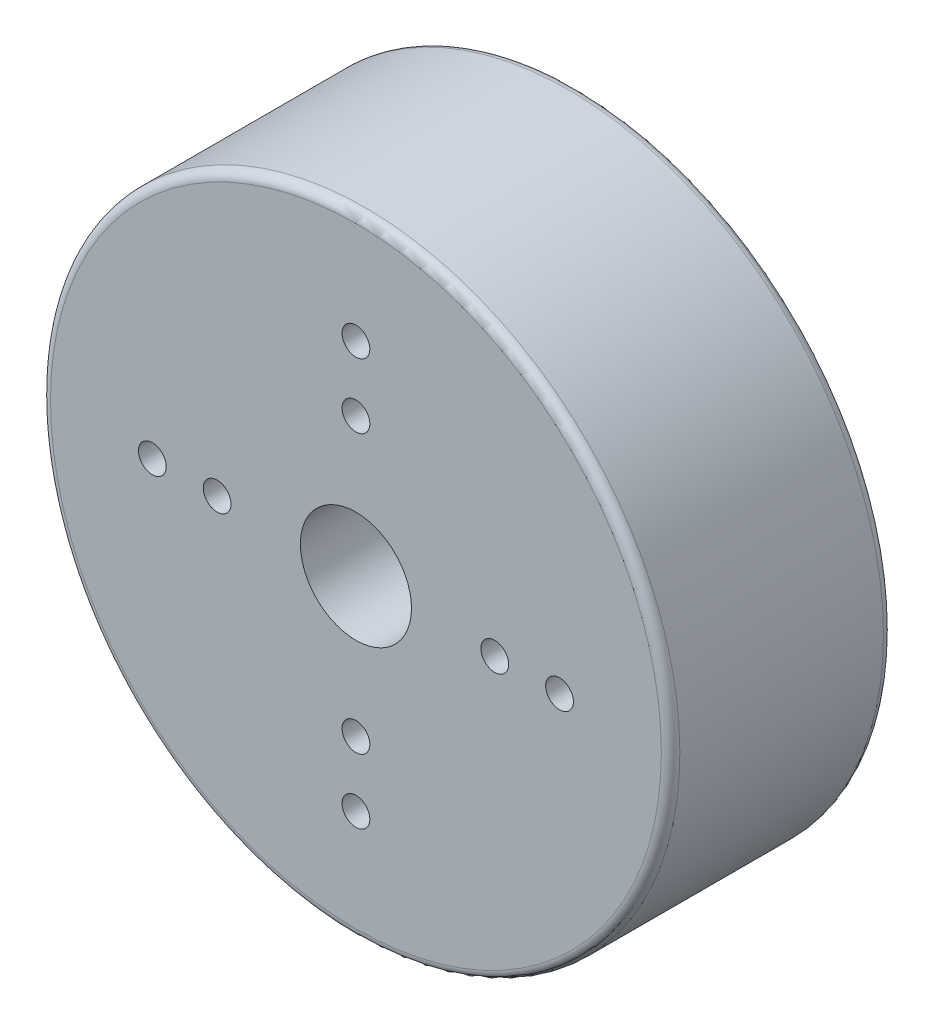
ISO-10303-21;
HEADER;
FILE_DESCRIPTION(('STEP AP214'),'2;1');
FILE_NAME('part.step','',(''),(''),'','','');
FILE_SCHEMA(('AUTOMOTIVE_DESIGN { 1 0 10303 214 1 1 1 1 }'));
ENDSEC;
DATA;
#1=APPLICATION_CONTEXT('core data for automotive mechanical design processes');
#2=APPLICATION_PROTOCOL_DEFINITION('international standard','automotive_design',2000,#1);
#3=PRODUCT_CONTEXT('',#1,'mechanical');
#4=PRODUCT('Part','Part','',(#3));
#5=PRODUCT_RELATED_PRODUCT_CATEGORY('part','',(#4));
#6=PRODUCT_DEFINITION_FORMATION('','',#4);
#7=PRODUCT_DEFINITION_CONTEXT('part definition',#1,'design');
#8=PRODUCT_DEFINITION('design','',#6,#7);
#9=PRODUCT_DEFINITION_SHAPE('','',#8);
#10=(LENGTH_UNIT() NAMED_UNIT(*) SI_UNIT(.MILLI.,.METRE.));
#11=(NAMED_UNIT(*) PLANE_ANGLE_UNIT() SI_UNIT($,.RADIAN.));
#12=(NAMED_UNIT(*) SI_UNIT($,.STERADIAN.) SOLID_ANGLE_UNIT());
#13=UNCERTAINTY_MEASURE_WITH_UNIT(LENGTH_MEASURE(1.E-05),#10,'distance_accuracy_value','');
#14=(GEOMETRIC_REPRESENTATION_CONTEXT(3) GLOBAL_UNCERTAINTY_ASSIGNED_CONTEXT((#13)) GLOBAL_UNIT_ASSIGNED_CONTEXT((#10,
#11,#12)) REPRESENTATION_CONTEXT('',''));
#15=CARTESIAN_POINT('',(0.,0.,0.));
#16=DIRECTION('',(0.,0.,1.));
#17=DIRECTION('',(1.,0.,0.));
#18=AXIS2_PLACEMENT_3D('',#15,#16,#17);
#19=CARTESIAN_POINT('',(0.,0.,24.));
#20=DIRECTION('',(0.,0.,-1.));
#21=DIRECTION('',(-1.,0.,0.));
#22=AXIS2_PLACEMENT_3D('',#19,#20,#21);
#23=CYLINDRICAL_SURFACE('',#22,34.);
#24=CARTESIAN_POINT('',(0.,0.,23.));
#25=DIRECTION('',(0.,0.,1.));
#26=DIRECTION('',(1.,0.,0.));
#27=AXIS2_PLACEMENT_3D('',#24,#25,#26);
#28=CIRCLE('',#27,34.);
#29=CARTESIAN_POINT('',(34.,0.,23.));
#30=VERTEX_POINT('',#29);
#31=EDGE_CURVE('E10',#30,#30,#28,.F.);
#32=ORIENTED_EDGE('',*,*,#31,.T.);
#33=EDGE_LOOP('',(#32));
#34=FACE_BOUND('',#33,.T.);
#35=CARTESIAN_POINT('',(0.,0.,1.));
#36=DIRECTION('',(0.,0.,1.));
#37=DIRECTION('',(1.,0.,0.));
#38=AXIS2_PLACEMENT_3D('',#35,#36,#37);
#39=CIRCLE('',#38,34.);
#40=CARTESIAN_POINT('',(34.,0.,1.));
#41=VERTEX_POINT('',#40);
#42=EDGE_CURVE('E55',#41,#41,#39,.T.);
#43=ORIENTED_EDGE('',*,*,#42,.T.);
#44=EDGE_LOOP('',(#43));
#45=FACE_BOUND('',#44,.T.);
#46=ADVANCED_FACE('F37',(#34,#45),#23,.T.);
#47=CARTESIAN_POINT('',(0.,0.,24.));
#48=DIRECTION('',(0.,0.,1.));
#49=DIRECTION('',(1.,0.,0.));
#50=AXIS2_PLACEMENT_3D('',#47,#48,#49);
#51=PLANE('',#50);
#52=CARTESIAN_POINT('',(0.,0.,24.));
#53=DIRECTION('',(0.,0.,1.));
#54=DIRECTION('',(1.,0.,0.));
#55=AXIS2_PLACEMENT_3D('',#52,#53,#54);
#56=CIRCLE('',#55,33.);
#57=CARTESIAN_POINT('',(33.,0.,24.));
#58=VERTEX_POINT('',#57);
#59=EDGE_CURVE('E45',#58,#58,#56,.T.);
#60=ORIENTED_EDGE('',*,*,#59,.T.);
#61=EDGE_LOOP('',(#60));
#62=FACE_BOUND('',#61,.T.);
#63=CARTESIAN_POINT('',(0.,22.,24.));
#64=DIRECTION('',(0.,0.,1.));
#65=DIRECTION('',(1.,0.,0.));
#66=AXIS2_PLACEMENT_3D('',#63,#64,#65);
#67=CIRCLE('',#66,1.5);
#68=CARTESIAN_POINT('',(1.5,22.,24.));
#69=VERTEX_POINT('',#68);
#70=EDGE_CURVE('E95',#69,#69,#67,.T.);
#71=ORIENTED_EDGE('',*,*,#70,.F.);
#72=EDGE_LOOP('',(#71));
#73=FACE_BOUND('',#72,.T.);
#74=CARTESIAN_POINT('',(0.,-15.,24.));
#75=DIRECTION('',(0.,0.,1.));
#76=DIRECTION('',(1.,0.,0.));
#77=AXIS2_PLACEMENT_3D('',#74,#75,#76);
#78=CIRCLE('',#77,1.5);
#79=CARTESIAN_POINT('',(1.5,-15.,24.));
#80=VERTEX_POINT('',#79);
#81=EDGE_CURVE('E127',#80,#80,#78,.T.);
#82=ORIENTED_EDGE('',*,*,#81,.F.);
#83=EDGE_LOOP('',(#82));
#84=FACE_BOUND('',#83,.T.);
#85=CARTESIAN_POINT('',(15.,0.,24.));
#86=DIRECTION('',(0.,0.,1.));
#87=DIRECTION('',(1.,0.,0.));
#88=AXIS2_PLACEMENT_3D('',#85,#86,#87);
#89=CIRCLE('',#88,1.5);
#90=CARTESIAN_POINT('',(16.5,0.,24.));
#91=VERTEX_POINT('',#90);
#92=EDGE_CURVE('E131',#91,#91,#89,.T.);
#93=ORIENTED_EDGE('',*,*,#92,.F.);
#94=EDGE_LOOP('',(#93));
#95=FACE_BOUND('',#94,.T.);
#96=CARTESIAN_POINT('',(-15.,0.,24.));
#97=DIRECTION('',(0.,0.,1.));
#98=DIRECTION('',(1.,0.,0.));
#99=AXIS2_PLACEMENT_3D('',#96,#97,#98);
#100=CIRCLE('',#99,1.5);
#101=CARTESIAN_POINT('',(-13.5,0.,24.));
#102=VERTEX_POINT('',#101);
#103=EDGE_CURVE('E123',#102,#102,#100,.T.);
#104=ORIENTED_EDGE('',*,*,#103,.F.);
#105=EDGE_LOOP('',(#104));
#106=FACE_BOUND('',#105,.T.);
#107=CARTESIAN_POINT('',(0.,-22.,24.));
#108=DIRECTION('',(0.,0.,1.));
#109=DIRECTION('',(1.,0.,0.));
#110=AXIS2_PLACEMENT_3D('',#107,#108,#109);
#111=CIRCLE('',#110,1.5);
#112=CARTESIAN_POINT('',(1.5,-22.,24.));
#113=VERTEX_POINT('',#112);
#114=EDGE_CURVE('E114',#113,#113,#111,.T.);
#115=ORIENTED_EDGE('',*,*,#114,.F.);
#116=EDGE_LOOP('',(#115));
#117=FACE_BOUND('',#116,.T.);
#118=CARTESIAN_POINT('',(-22.,0.,24.));
#119=DIRECTION('',(0.,0.,1.));
#120=DIRECTION('',(1.,0.,0.));
#121=AXIS2_PLACEMENT_3D('',#118,#119,#120);
#122=CIRCLE('',#121,1.5);
#123=CARTESIAN_POINT('',(-20.5,0.,24.));
#124=VERTEX_POINT('',#123);
#125=EDGE_CURVE('E110',#124,#124,#122,.T.);
#126=ORIENTED_EDGE('',*,*,#125,.F.);
#127=EDGE_LOOP('',(#126));
#128=FACE_BOUND('',#127,.T.);
#129=CARTESIAN_POINT('',(22.,0.,24.));
#130=DIRECTION('',(0.,0.,1.));
#131=DIRECTION('',(1.,0.,0.));
#132=AXIS2_PLACEMENT_3D('',#129,#130,#131);
#133=CIRCLE('',#132,1.5);
#134=CARTESIAN_POINT('',(23.5,0.,24.));
#135=VERTEX_POINT('',#134);
#136=EDGE_CURVE('E115',#135,#135,#133,.T.);
#137=ORIENTED_EDGE('',*,*,#136,.F.);
#138=EDGE_LOOP('',(#137));
#139=FACE_BOUND('',#138,.T.);
#140=CARTESIAN_POINT('',(0.,15.,24.));
#141=DIRECTION('',(0.,0.,1.));
#142=DIRECTION('',(1.,0.,0.));
#143=AXIS2_PLACEMENT_3D('',#140,#141,#142);
#144=CIRCLE('',#143,1.5);
#145=CARTESIAN_POINT('',(1.5,15.,24.));
#146=VERTEX_POINT('',#145);
#147=EDGE_CURVE('E119',#146,#146,#144,.T.);
#148=ORIENTED_EDGE('',*,*,#147,.F.);
#149=EDGE_LOOP('',(#148));
#150=FACE_BOUND('',#149,.T.);
#151=CARTESIAN_POINT('',(0.,0.,24.));
#152=DIRECTION('',(0.,0.,1.));
#153=DIRECTION('',(1.,0.,0.));
#154=AXIS2_PLACEMENT_3D('',#151,#152,#153);
#155=CIRCLE('',#154,6.);
#156=CARTESIAN_POINT('',(6.,0.,24.));
#157=VERTEX_POINT('',#156);
#158=EDGE_CURVE('E103',#157,#157,#155,.T.);
#159=ORIENTED_EDGE('',*,*,#158,.F.);
#160=EDGE_LOOP('',(#159));
#161=FACE_BOUND('',#160,.T.);
#162=ADVANCED_FACE('F145',(#62,#73,#84,#95,#106,#117,#128,#139,#150,#161),#51,.T.);
#163=CARTESIAN_POINT('',(0.,0.,0.));
#164=DIRECTION('',(0.,0.,1.));
#165=DIRECTION('',(1.,0.,0.));
#166=AXIS2_PLACEMENT_3D('',#163,#164,#165);
#167=PLANE('',#166);
#168=CARTESIAN_POINT('',(0.,0.,0.));
#169=DIRECTION('',(0.,0.,1.));
#170=DIRECTION('',(1.,0.,0.));
#171=AXIS2_PLACEMENT_3D('',#168,#169,#170);
#172=CIRCLE('',#171,33.);
#173=CARTESIAN_POINT('',(33.,0.,0.));
#174=VERTEX_POINT('',#173);
#175=EDGE_CURVE('E50',#174,#174,#172,.F.);
#176=ORIENTED_EDGE('',*,*,#175,.T.);
#177=EDGE_LOOP('',(#176));
#178=FACE_BOUND('',#177,.T.);
#179=CARTESIAN_POINT('',(0.,22.,0.));
#180=DIRECTION('',(0.,0.,1.));
#181=DIRECTION('',(1.,0.,0.));
#182=AXIS2_PLACEMENT_3D('',#179,#180,#181);
#183=CIRCLE('',#182,1.5);
#184=CARTESIAN_POINT('',(1.5,22.,0.));
#185=VERTEX_POINT('',#184);
#186=EDGE_CURVE('E62',#185,#185,#183,.T.);
#187=ORIENTED_EDGE('',*,*,#186,.T.);
#188=EDGE_LOOP('',(#187));
#189=FACE_BOUND('',#188,.T.);
#190=CARTESIAN_POINT('',(0.,-15.,0.));
#191=DIRECTION('',(0.,0.,1.));
#192=DIRECTION('',(1.,0.,0.));
#193=AXIS2_PLACEMENT_3D('',#190,#191,#192);
#194=CIRCLE('',#193,1.5);
#195=CARTESIAN_POINT('',(1.5,-15.,0.));
#196=VERTEX_POINT('',#195);
#197=EDGE_CURVE('E67',#196,#196,#194,.T.);
#198=ORIENTED_EDGE('',*,*,#197,.T.);
#199=EDGE_LOOP('',(#198));
#200=FACE_BOUND('',#199,.T.);
#201=CARTESIAN_POINT('',(15.,0.,0.));
#202=DIRECTION('',(0.,0.,1.));
#203=DIRECTION('',(1.,0.,0.));
#204=AXIS2_PLACEMENT_3D('',#201,#202,#203);
#205=CIRCLE('',#204,1.5);
#206=CARTESIAN_POINT('',(16.5,0.,0.));
#207=VERTEX_POINT('',#206);
#208=EDGE_CURVE('E71',#207,#207,#205,.T.);
#209=ORIENTED_EDGE('',*,*,#208,.T.);
#210=EDGE_LOOP('',(#209));
#211=FACE_BOUND('',#210,.T.);
#212=CARTESIAN_POINT('',(-15.,0.,0.));
#213=DIRECTION('',(0.,0.,1.));
#214=DIRECTION('',(1.,0.,0.));
#215=AXIS2_PLACEMENT_3D('',#212,#213,#214);
#216=CIRCLE('',#215,1.5);
#217=CARTESIAN_POINT('',(-13.5,0.,0.));
#218=VERTEX_POINT('',#217);
#219=EDGE_CURVE('E75',#218,#218,#216,.T.);
#220=ORIENTED_EDGE('',*,*,#219,.T.);
#221=EDGE_LOOP('',(#220));
#222=FACE_BOUND('',#221,.T.);
#223=CARTESIAN_POINT('',(0.,-22.,0.));
#224=DIRECTION('',(0.,0.,1.));
#225=DIRECTION('',(1.,0.,0.));
#226=AXIS2_PLACEMENT_3D('',#223,#224,#225);
#227=CIRCLE('',#226,1.5);
#228=CARTESIAN_POINT('',(1.5,-22.,0.));
#229=VERTEX_POINT('',#228);
#230=EDGE_CURVE('E79',#229,#229,#227,.T.);
#231=ORIENTED_EDGE('',*,*,#230,.T.);
#232=EDGE_LOOP('',(#231));
#233=FACE_BOUND('',#232,.T.);
#234=CARTESIAN_POINT('',(-22.,0.,0.));
#235=DIRECTION('',(0.,0.,1.));
#236=DIRECTION('',(1.,0.,0.));
#237=AXIS2_PLACEMENT_3D('',#234,#235,#236);
#238=CIRCLE('',#237,1.5);
#239=CARTESIAN_POINT('',(-20.5,0.,0.));
#240=VERTEX_POINT('',#239);
#241=EDGE_CURVE('E83',#240,#240,#238,.T.);
#242=ORIENTED_EDGE('',*,*,#241,.T.);
#243=EDGE_LOOP('',(#242));
#244=FACE_BOUND('',#243,.T.);
#245=CARTESIAN_POINT('',(22.,0.,0.));
#246=DIRECTION('',(0.,0.,1.));
#247=DIRECTION('',(1.,0.,0.));
#248=AXIS2_PLACEMENT_3D('',#245,#246,#247);
#249=CIRCLE('',#248,1.5);
#250=CARTESIAN_POINT('',(23.5,0.,0.));
#251=VERTEX_POINT('',#250);
#252=EDGE_CURVE('E87',#251,#251,#249,.T.);
#253=ORIENTED_EDGE('',*,*,#252,.T.);
#254=EDGE_LOOP('',(#253));
#255=FACE_BOUND('',#254,.T.);
#256=CARTESIAN_POINT('',(0.,15.,0.));
#257=DIRECTION('',(0.,0.,1.));
#258=DIRECTION('',(1.,0.,0.));
#259=AXIS2_PLACEMENT_3D('',#256,#257,#258);
#260=CIRCLE('',#259,1.5);
#261=CARTESIAN_POINT('',(1.5,15.,0.));
#262=VERTEX_POINT('',#261);
#263=EDGE_CURVE('E91',#262,#262,#260,.T.);
#264=ORIENTED_EDGE('',*,*,#263,.T.);
#265=EDGE_LOOP('',(#264));
#266=FACE_BOUND('',#265,.T.);
#267=CARTESIAN_POINT('',(0.,0.,0.));
#268=DIRECTION('',(0.,0.,-1.));
#269=DIRECTION('',(-1.,0.,0.));
#270=AXIS2_PLACEMENT_3D('',#267,#268,#269);
#271=CIRCLE('',#270,7.);
#272=CARTESIAN_POINT('',(-7.,0.,0.));
#273=VERTEX_POINT('',#272);
#274=EDGE_CURVE('E61',#273,#273,#271,.T.);
#275=ORIENTED_EDGE('',*,*,#274,.F.);
#276=EDGE_LOOP('',(#275));
#277=FACE_BOUND('',#276,.T.);
#278=ADVANCED_FACE('F148',(#178,#189,#200,#211,#222,#233,#244,#255,#266,#277),#167,.F.);
#279=CARTESIAN_POINT('',(0.,0.,-1.1));
#280=DIRECTION('',(0.,0.,1.));
#281=DIRECTION('',(1.,0.,0.));
#282=AXIS2_PLACEMENT_3D('',#279,#280,#281);
#283=CYLINDRICAL_SURFACE('',#282,7.);
#284=CARTESIAN_POINT('',(0.,0.,-1.1));
#285=DIRECTION('',(0.,0.,-1.));
#286=DIRECTION('',(-1.,0.,0.));
#287=AXIS2_PLACEMENT_3D('',#284,#285,#286);
#288=CIRCLE('',#287,7.);
#289=CARTESIAN_POINT('',(-7.,0.,-1.1));
#290=VERTEX_POINT('',#289);
#291=EDGE_CURVE('E99',#290,#290,#288,.T.);
#292=ORIENTED_EDGE('',*,*,#291,.F.);
#293=EDGE_LOOP('',(#292));
#294=FACE_BOUND('',#293,.T.);
#295=ORIENTED_EDGE('',*,*,#274,.T.);
#296=EDGE_LOOP('',(#295));
#297=FACE_BOUND('',#296,.T.);
#298=ADVANCED_FACE('F176',(#294,#297),#283,.T.);
#299=CARTESIAN_POINT('',(0.,0.,-1.1));
#300=DIRECTION('',(0.,0.,-1.));
#301=DIRECTION('',(-1.,0.,0.));
#302=AXIS2_PLACEMENT_3D('',#299,#300,#301);
#303=PLANE('',#302);
#304=CARTESIAN_POINT('',(0.,0.,-1.1));
#305=DIRECTION('',(0.,0.,-1.));
#306=DIRECTION('',(-1.,0.,0.));
#307=AXIS2_PLACEMENT_3D('',#304,#305,#306);
#308=CIRCLE('',#307,6.);
#309=CARTESIAN_POINT('',(-6.,0.,-1.1));
#310=VERTEX_POINT('',#309);
#311=EDGE_CURVE('E66',#310,#310,#308,.T.);
#312=ORIENTED_EDGE('',*,*,#311,.F.);
#313=EDGE_LOOP('',(#312));
#314=FACE_BOUND('',#313,.T.);
#315=ORIENTED_EDGE('',*,*,#291,.T.);
#316=EDGE_LOOP('',(#315));
#317=FACE_BOUND('',#316,.T.);
#318=ADVANCED_FACE('F170',(#314,#317),#303,.T.);
#319=CARTESIAN_POINT('',(0.,0.,27.));
#320=DIRECTION('',(0.,0.,-1.));
#321=DIRECTION('',(-1.,0.,0.));
#322=AXIS2_PLACEMENT_3D('',#319,#320,#321);
#323=CYLINDRICAL_SURFACE('',#322,6.);
#324=ORIENTED_EDGE('',*,*,#158,.T.);
#325=EDGE_LOOP('',(#324));
#326=FACE_BOUND('',#325,.T.);
#327=ORIENTED_EDGE('',*,*,#311,.T.);
#328=EDGE_LOOP('',(#327));
#329=FACE_BOUND('',#328,.T.);
#330=ADVANCED_FACE('F166',(#326,#329),#323,.F.);
#331=CARTESIAN_POINT('',(0.,15.,-4.1));
#332=DIRECTION('',(0.,0.,1.));
#333=DIRECTION('',(1.,0.,0.));
#334=AXIS2_PLACEMENT_3D('',#331,#332,#333);
#335=CYLINDRICAL_SURFACE('',#334,1.5);
#336=ORIENTED_EDGE('',*,*,#147,.T.);
#337=EDGE_LOOP('',(#336));
#338=FACE_BOUND('',#337,.T.);
#339=ORIENTED_EDGE('',*,*,#263,.F.);
#340=EDGE_LOOP('',(#339));
#341=FACE_BOUND('',#340,.T.);
#342=ADVANCED_FACE('F169',(#338,#341),#335,.F.);
#343=CARTESIAN_POINT('',(22.,0.,-4.1));
#344=DIRECTION('',(0.,0.,1.));
#345=DIRECTION('',(1.,0.,0.));
#346=AXIS2_PLACEMENT_3D('',#343,#344,#345);
#347=CYLINDRICAL_SURFACE('',#346,1.5);
#348=ORIENTED_EDGE('',*,*,#136,.T.);
#349=EDGE_LOOP('',(#348));
#350=FACE_BOUND('',#349,.T.);
#351=ORIENTED_EDGE('',*,*,#252,.F.);
#352=EDGE_LOOP('',(#351));
#353=FACE_BOUND('',#352,.T.);
#354=ADVANCED_FACE('F224',(#350,#353),#347,.F.);
#355=CARTESIAN_POINT('',(-22.,0.,-4.1));
#356=DIRECTION('',(0.,0.,1.));
#357=DIRECTION('',(1.,0.,0.));
#358=AXIS2_PLACEMENT_3D('',#355,#356,#357);
#359=CYLINDRICAL_SURFACE('',#358,1.5);
#360=ORIENTED_EDGE('',*,*,#125,.T.);
#361=EDGE_LOOP('',(#360));
#362=FACE_BOUND('',#361,.T.);
#363=ORIENTED_EDGE('',*,*,#241,.F.);
#364=EDGE_LOOP('',(#363));
#365=FACE_BOUND('',#364,.T.);
#366=ADVANCED_FACE('F227',(#362,#365),#359,.F.);
#367=CARTESIAN_POINT('',(0.,-22.,-4.1));
#368=DIRECTION('',(0.,0.,1.));
#369=DIRECTION('',(1.,0.,0.));
#370=AXIS2_PLACEMENT_3D('',#367,#368,#369);
#371=CYLINDRICAL_SURFACE('',#370,1.5);
#372=ORIENTED_EDGE('',*,*,#114,.T.);
#373=EDGE_LOOP('',(#372));
#374=FACE_BOUND('',#373,.T.);
#375=ORIENTED_EDGE('',*,*,#230,.F.);
#376=EDGE_LOOP('',(#375));
#377=FACE_BOUND('',#376,.T.);
#378=ADVANCED_FACE('F219',(#374,#377),#371,.F.);
#379=CARTESIAN_POINT('',(-15.,0.,-4.1));
#380=DIRECTION('',(0.,0.,1.));
#381=DIRECTION('',(1.,0.,0.));
#382=AXIS2_PLACEMENT_3D('',#379,#380,#381);
#383=CYLINDRICAL_SURFACE('',#382,1.5);
#384=ORIENTED_EDGE('',*,*,#103,.T.);
#385=EDGE_LOOP('',(#384));
#386=FACE_BOUND('',#385,.T.);
#387=ORIENTED_EDGE('',*,*,#219,.F.);
#388=EDGE_LOOP('',(#387));
#389=FACE_BOUND('',#388,.T.);
#390=ADVANCED_FACE('F216',(#386,#389),#383,.F.);
#391=CARTESIAN_POINT('',(15.,0.,-4.1));
#392=DIRECTION('',(0.,0.,1.));
#393=DIRECTION('',(1.,0.,0.));
#394=AXIS2_PLACEMENT_3D('',#391,#392,#393);
#395=CYLINDRICAL_SURFACE('',#394,1.5);
#396=ORIENTED_EDGE('',*,*,#92,.T.);
#397=EDGE_LOOP('',(#396));
#398=FACE_BOUND('',#397,.T.);
#399=ORIENTED_EDGE('',*,*,#208,.F.);
#400=EDGE_LOOP('',(#399));
#401=FACE_BOUND('',#400,.T.);
#402=ADVANCED_FACE('F212',(#398,#401),#395,.F.);
#403=CARTESIAN_POINT('',(0.,-15.,-4.1));
#404=DIRECTION('',(0.,0.,1.));
#405=DIRECTION('',(1.,0.,0.));
#406=AXIS2_PLACEMENT_3D('',#403,#404,#405);
#407=CYLINDRICAL_SURFACE('',#406,1.5);
#408=ORIENTED_EDGE('',*,*,#81,.T.);
#409=EDGE_LOOP('',(#408));
#410=FACE_BOUND('',#409,.T.);
#411=ORIENTED_EDGE('',*,*,#197,.F.);
#412=EDGE_LOOP('',(#411));
#413=FACE_BOUND('',#412,.T.);
#414=ADVANCED_FACE('F204',(#410,#413),#407,.F.);
#415=CARTESIAN_POINT('',(0.,22.,-4.1));
#416=DIRECTION('',(0.,0.,1.));
#417=DIRECTION('',(1.,0.,0.));
#418=AXIS2_PLACEMENT_3D('',#415,#416,#417);
#419=CYLINDRICAL_SURFACE('',#418,1.5);
#420=ORIENTED_EDGE('',*,*,#70,.T.);
#421=EDGE_LOOP('',(#420));
#422=FACE_BOUND('',#421,.T.);
#423=ORIENTED_EDGE('',*,*,#186,.F.);
#424=EDGE_LOOP('',(#423));
#425=FACE_BOUND('',#424,.T.);
#426=ADVANCED_FACE('F142',(#422,#425),#419,.F.);
#427=CARTESIAN_POINT('',(0.,0.,1.));
#428=DIRECTION('',(0.,0.,1.));
#429=DIRECTION('',(1.,0.,0.));
#430=AXIS2_PLACEMENT_3D('',#427,#428,#429);
#431=TOROIDAL_SURFACE('',#430,33.,1.);
#432=ORIENTED_EDGE('',*,*,#175,.F.);
#433=EDGE_LOOP('',(#432));
#434=FACE_BOUND('',#433,.T.);
#435=ORIENTED_EDGE('',*,*,#42,.F.);
#436=EDGE_LOOP('',(#435));
#437=FACE_BOUND('',#436,.T.);
#438=ADVANCED_FACE('F196',(#434,#437),#431,.T.);
#439=CARTESIAN_POINT('',(0.,0.,23.));
#440=DIRECTION('',(0.,0.,1.));
#441=DIRECTION('',(1.,0.,0.));
#442=AXIS2_PLACEMENT_3D('',#439,#440,#441);
#443=TOROIDAL_SURFACE('',#442,33.,1.);
#444=ORIENTED_EDGE('',*,*,#31,.F.);
#445=EDGE_LOOP('',(#444));
#446=FACE_BOUND('',#445,.T.);
#447=ORIENTED_EDGE('',*,*,#59,.F.);
#448=EDGE_LOOP('',(#447));
#449=FACE_BOUND('',#448,.T.);
#450=ADVANCED_FACE('F39',(#446,#449),#443,.T.);
#451=CLOSED_SHELL('',(#46,#162,#278,#298,#318,#330,#342,#354,#366,#378,#390,#402,#414,#426,#438,#450));
#452=MANIFOLD_SOLID_BREP('B2',#451);
#453=ADVANCED_BREP_SHAPE_REPRESENTATION('',(#18,#452),#14);
#454=SHAPE_DEFINITION_REPRESENTATION(#9,#453);
ENDSEC;
END-ISO-10303-21;
